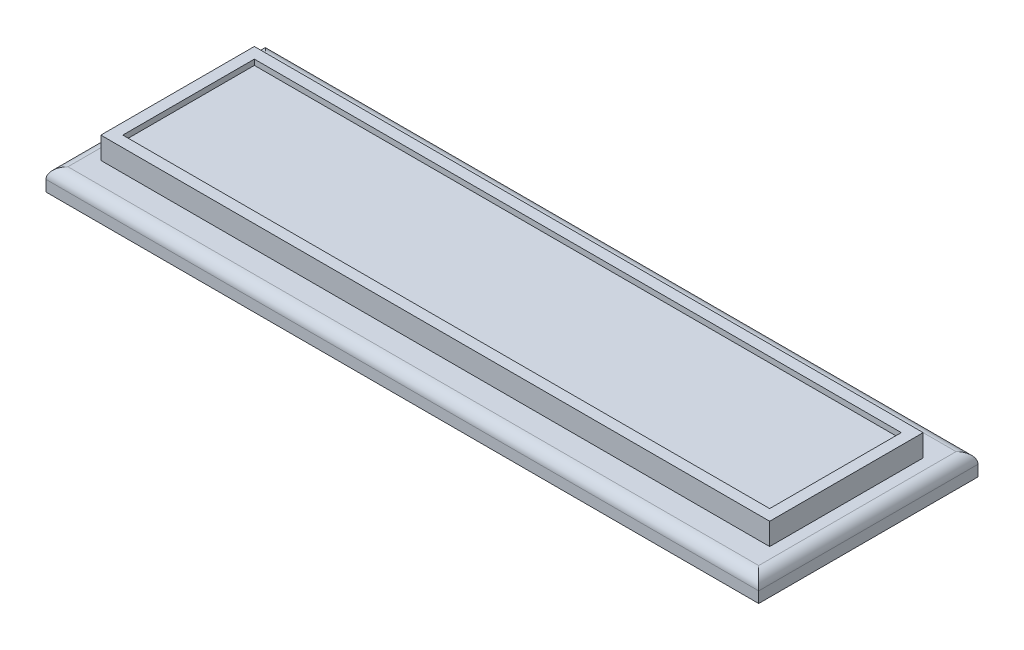
ISO-10303-21;
HEADER;
FILE_DESCRIPTION(('STEP AP214'),'2;1');
FILE_NAME('part.step','',(''),(''),'','','');
FILE_SCHEMA(('AUTOMOTIVE_DESIGN { 1 0 10303 214 1 1 1 1 }'));
ENDSEC;
DATA;
#1=APPLICATION_CONTEXT('core data for automotive mechanical design processes');
#2=APPLICATION_PROTOCOL_DEFINITION('international standard','automotive_design',2000,#1);
#3=PRODUCT_CONTEXT('',#1,'mechanical');
#4=PRODUCT('Part','Part','',(#3));
#5=PRODUCT_RELATED_PRODUCT_CATEGORY('part','',(#4));
#6=PRODUCT_DEFINITION_FORMATION('','',#4);
#7=PRODUCT_DEFINITION_CONTEXT('part definition',#1,'design');
#8=PRODUCT_DEFINITION('design','',#6,#7);
#9=PRODUCT_DEFINITION_SHAPE('','',#8);
#10=(LENGTH_UNIT() NAMED_UNIT(*) SI_UNIT(.MILLI.,.METRE.));
#11=(NAMED_UNIT(*) PLANE_ANGLE_UNIT() SI_UNIT($,.RADIAN.));
#12=(NAMED_UNIT(*) SI_UNIT($,.STERADIAN.) SOLID_ANGLE_UNIT());
#13=UNCERTAINTY_MEASURE_WITH_UNIT(LENGTH_MEASURE(1.E-05),#10,'distance_accuracy_value','');
#14=(GEOMETRIC_REPRESENTATION_CONTEXT(3) GLOBAL_UNCERTAINTY_ASSIGNED_CONTEXT((#13)) GLOBAL_UNIT_ASSIGNED_CONTEXT((#10,
#11,#12)) REPRESENTATION_CONTEXT('',''));
#15=CARTESIAN_POINT('',(0.,0.,0.));
#16=DIRECTION('',(0.,0.,1.));
#17=DIRECTION('',(1.,0.,0.));
#18=AXIS2_PLACEMENT_3D('',#15,#16,#17);
#19=CARTESIAN_POINT('',(0.,4.,0.));
#20=DIRECTION('',(0.,1.,0.));
#21=DIRECTION('',(0.,0.,1.));
#22=AXIS2_PLACEMENT_3D('',#19,#20,#21);
#23=PLANE('',#22);
#24=DIRECTION('',(0.,0.,1.));
#25=VECTOR('',#24,1.);
#26=CARTESIAN_POINT('',(2.,4.,3.));
#27=LINE('',#26,#25);
#28=CARTESIAN_POINT('',(2.,4.,3.));
#29=VERTEX_POINT('',#28);
#30=CARTESIAN_POINT('',(2.,4.,17.));
#31=VERTEX_POINT('',#30);
#32=EDGE_CURVE('E171',#29,#31,#27,.T.);
#33=ORIENTED_EDGE('',*,*,#32,.T.);
#34=DIRECTION('',(1.,0.,0.));
#35=VECTOR('',#34,1.);
#36=CARTESIAN_POINT('',(2.,4.,17.));
#37=LINE('',#36,#35);
#38=CARTESIAN_POINT('',(63.,4.,17.));
#39=VERTEX_POINT('',#38);
#40=EDGE_CURVE('E174',#31,#39,#37,.T.);
#41=ORIENTED_EDGE('',*,*,#40,.T.);
#42=DIRECTION('',(0.,0.,-1.));
#43=VECTOR('',#42,1.);
#44=CARTESIAN_POINT('',(63.,4.,3.));
#45=LINE('',#44,#43);
#46=CARTESIAN_POINT('',(63.,4.,3.));
#47=VERTEX_POINT('',#46);
#48=EDGE_CURVE('E177',#39,#47,#45,.T.);
#49=ORIENTED_EDGE('',*,*,#48,.T.);
#50=DIRECTION('',(-1.,0.,0.));
#51=VECTOR('',#50,1.);
#52=CARTESIAN_POINT('',(2.,4.,3.));
#53=LINE('',#52,#51);
#54=EDGE_CURVE('E179',#47,#29,#53,.T.);
#55=ORIENTED_EDGE('',*,*,#54,.T.);
#56=EDGE_LOOP('',(#33,#41,#49,#55));
#57=FACE_BOUND('',#56,.T.);
#58=DIRECTION('',(0.,0.,1.));
#59=VECTOR('',#58,1.);
#60=CARTESIAN_POINT('',(3.,4.,3.99615271282854));
#61=LINE('',#60,#59);
#62=CARTESIAN_POINT('',(3.,4.,3.99615271282854));
#63=VERTEX_POINT('',#62);
#64=CARTESIAN_POINT('',(3.,4.,16.));
#65=VERTEX_POINT('',#64);
#66=EDGE_CURVE('E156',#63,#65,#61,.T.);
#67=ORIENTED_EDGE('',*,*,#66,.F.);
#68=DIRECTION('',(1.,0.,0.));
#69=VECTOR('',#68,1.);
#70=CARTESIAN_POINT('',(3.,4.,3.99615271282854));
#71=LINE('',#70,#69);
#72=CARTESIAN_POINT('',(62.,4.,3.99615271282854));
#73=VERTEX_POINT('',#72);
#74=EDGE_CURVE('E240',#63,#73,#71,.T.);
#75=ORIENTED_EDGE('',*,*,#74,.T.);
#76=DIRECTION('',(0.,0.,1.));
#77=VECTOR('',#76,1.);
#78=CARTESIAN_POINT('',(62.,4.,3.99615271282854));
#79=LINE('',#78,#77);
#80=CARTESIAN_POINT('',(62.,4.,16.));
#81=VERTEX_POINT('',#80);
#82=EDGE_CURVE('E160',#73,#81,#79,.T.);
#83=ORIENTED_EDGE('',*,*,#82,.T.);
#84=DIRECTION('',(1.,0.,0.));
#85=VECTOR('',#84,1.);
#86=CARTESIAN_POINT('',(3.,4.,16.));
#87=LINE('',#86,#85);
#88=EDGE_CURVE('E247',#65,#81,#87,.T.);
#89=ORIENTED_EDGE('',*,*,#88,.F.);
#90=EDGE_LOOP('',(#67,#75,#83,#89));
#91=FACE_BOUND('',#90,.T.);
#92=ADVANCED_FACE('F35',(#57,#91),#23,.T.);
#93=CARTESIAN_POINT('',(0.,2.,0.));
#94=DIRECTION('',(0.,1.,0.));
#95=DIRECTION('',(0.,0.,1.));
#96=AXIS2_PLACEMENT_3D('',#93,#94,#95);
#97=PLANE('',#96);
#98=DIRECTION('',(0.,0.,1.));
#99=VECTOR('',#98,1.);
#100=CARTESIAN_POINT('',(1.,2.,20.));
#101=LINE('',#100,#99);
#102=CARTESIAN_POINT('',(1.,2.,1.));
#103=VERTEX_POINT('',#102);
#104=CARTESIAN_POINT('',(1.,2.,19.));
#105=VERTEX_POINT('',#104);
#106=EDGE_CURVE('E220',#103,#105,#101,.T.);
#107=ORIENTED_EDGE('',*,*,#106,.T.);
#108=DIRECTION('',(1.,0.,0.));
#109=VECTOR('',#108,1.);
#110=CARTESIAN_POINT('',(65.,2.,19.));
#111=LINE('',#110,#109);
#112=CARTESIAN_POINT('',(64.,2.,19.));
#113=VERTEX_POINT('',#112);
#114=EDGE_CURVE('E223',#105,#113,#111,.T.);
#115=ORIENTED_EDGE('',*,*,#114,.T.);
#116=DIRECTION('',(0.,0.,-1.));
#117=VECTOR('',#116,1.);
#118=CARTESIAN_POINT('',(64.,2.,0.));
#119=LINE('',#118,#117);
#120=CARTESIAN_POINT('',(64.,2.,1.));
#121=VERTEX_POINT('',#120);
#122=EDGE_CURVE('E218',#113,#121,#119,.T.);
#123=ORIENTED_EDGE('',*,*,#122,.T.);
#124=DIRECTION('',(-1.,0.,0.));
#125=VECTOR('',#124,1.);
#126=CARTESIAN_POINT('',(0.,2.,1.));
#127=LINE('',#126,#125);
#128=EDGE_CURVE('E216',#121,#103,#127,.T.);
#129=ORIENTED_EDGE('',*,*,#128,.T.);
#130=EDGE_LOOP('',(#107,#115,#123,#129));
#131=FACE_BOUND('',#130,.T.);
#132=DIRECTION('',(1.,0.,0.));
#133=VECTOR('',#132,1.);
#134=CARTESIAN_POINT('',(2.,2.,17.));
#135=LINE('',#134,#133);
#136=CARTESIAN_POINT('',(2.,2.,17.));
#137=VERTEX_POINT('',#136);
#138=CARTESIAN_POINT('',(63.,2.,17.));
#139=VERTEX_POINT('',#138);
#140=EDGE_CURVE('E165',#137,#139,#135,.T.);
#141=ORIENTED_EDGE('',*,*,#140,.F.);
#142=DIRECTION('',(0.,0.,1.));
#143=VECTOR('',#142,1.);
#144=CARTESIAN_POINT('',(2.,2.,3.));
#145=LINE('',#144,#143);
#146=CARTESIAN_POINT('',(2.,2.,3.));
#147=VERTEX_POINT('',#146);
#148=EDGE_CURVE('E161',#147,#137,#145,.T.);
#149=ORIENTED_EDGE('',*,*,#148,.F.);
#150=DIRECTION('',(-1.,0.,0.));
#151=VECTOR('',#150,1.);
#152=CARTESIAN_POINT('',(2.,2.,3.));
#153=LINE('',#152,#151);
#154=CARTESIAN_POINT('',(63.,2.,3.));
#155=VERTEX_POINT('',#154);
#156=EDGE_CURVE('E175',#155,#147,#153,.T.);
#157=ORIENTED_EDGE('',*,*,#156,.F.);
#158=DIRECTION('',(0.,0.,-1.));
#159=VECTOR('',#158,1.);
#160=CARTESIAN_POINT('',(63.,2.,3.));
#161=LINE('',#160,#159);
#162=EDGE_CURVE('E183',#139,#155,#161,.T.);
#163=ORIENTED_EDGE('',*,*,#162,.F.);
#164=EDGE_LOOP('',(#141,#149,#157,#163));
#165=FACE_BOUND('',#164,.T.);
#166=ADVANCED_FACE('F263',(#131,#165),#97,.T.);
#167=CARTESIAN_POINT('',(0.,2.,0.));
#168=DIRECTION('',(1.,0.,0.));
#169=DIRECTION('',(0.,0.,-1.));
#170=AXIS2_PLACEMENT_3D('',#167,#168,#169);
#171=PLANE('',#170);
#172=DIRECTION('',(0.,-1.,0.));
#173=VECTOR('',#172,1.);
#174=CARTESIAN_POINT('',(0.,2.,20.));
#175=LINE('',#174,#173);
#176=CARTESIAN_POINT('',(0.,1.,20.));
#177=VERTEX_POINT('',#176);
#178=CARTESIAN_POINT('',(0.,0.,20.));
#179=VERTEX_POINT('',#178);
#180=EDGE_CURVE('E214',#177,#179,#175,.T.);
#181=ORIENTED_EDGE('',*,*,#180,.F.);
#182=DIRECTION('',(0.,0.,1.));
#183=VECTOR('',#182,1.);
#184=CARTESIAN_POINT('',(0.,1.,0.));
#185=LINE('',#184,#183);
#186=CARTESIAN_POINT('',(0.,1.,0.));
#187=VERTEX_POINT('',#186);
#188=EDGE_CURVE('E225',#177,#187,#185,.F.);
#189=ORIENTED_EDGE('',*,*,#188,.T.);
#190=DIRECTION('',(0.,-1.,0.));
#191=VECTOR('',#190,1.);
#192=CARTESIAN_POINT('',(0.,2.,0.));
#193=LINE('',#192,#191);
#194=CARTESIAN_POINT('',(0.,0.,0.));
#195=VERTEX_POINT('',#194);
#196=EDGE_CURVE('E208',#187,#195,#193,.T.);
#197=ORIENTED_EDGE('',*,*,#196,.T.);
#198=DIRECTION('',(0.,0.,1.));
#199=VECTOR('',#198,1.);
#200=CARTESIAN_POINT('',(0.,0.,0.));
#201=LINE('',#200,#199);
#202=EDGE_CURVE('E196',#195,#179,#201,.T.);
#203=ORIENTED_EDGE('',*,*,#202,.T.);
#204=EDGE_LOOP('',(#181,#189,#197,#203));
#205=FACE_BOUND('',#204,.T.);
#206=ADVANCED_FACE('F269',(#205),#171,.F.);
#207=CARTESIAN_POINT('',(0.,2.,20.));
#208=DIRECTION('',(0.,0.,-1.));
#209=DIRECTION('',(-1.,0.,0.));
#210=AXIS2_PLACEMENT_3D('',#207,#208,#209);
#211=PLANE('',#210);
#212=DIRECTION('',(0.,-1.,0.));
#213=VECTOR('',#212,1.);
#214=CARTESIAN_POINT('',(65.,2.,20.));
#215=LINE('',#214,#213);
#216=CARTESIAN_POINT('',(65.,1.,20.));
#217=VERTEX_POINT('',#216);
#218=CARTESIAN_POINT('',(65.,0.,20.));
#219=VERTEX_POINT('',#218);
#220=EDGE_CURVE('E212',#217,#219,#215,.T.);
#221=ORIENTED_EDGE('',*,*,#220,.F.);
#222=DIRECTION('',(1.,0.,0.));
#223=VECTOR('',#222,1.);
#224=CARTESIAN_POINT('',(0.,1.,20.));
#225=LINE('',#224,#223);
#226=EDGE_CURVE('E44',#217,#177,#225,.F.);
#227=ORIENTED_EDGE('',*,*,#226,.T.);
#228=ORIENTED_EDGE('',*,*,#180,.T.);
#229=DIRECTION('',(1.,0.,0.));
#230=VECTOR('',#229,1.);
#231=CARTESIAN_POINT('',(0.,0.,20.));
#232=LINE('',#231,#230);
#233=EDGE_CURVE('E199',#179,#219,#232,.T.);
#234=ORIENTED_EDGE('',*,*,#233,.T.);
#235=EDGE_LOOP('',(#221,#227,#228,#234));
#236=FACE_BOUND('',#235,.T.);
#237=ADVANCED_FACE('F301',(#236),#211,.F.);
#238=CARTESIAN_POINT('',(65.,2.,0.));
#239=DIRECTION('',(-1.,0.,0.));
#240=DIRECTION('',(0.,0.,1.));
#241=AXIS2_PLACEMENT_3D('',#238,#239,#240);
#242=PLANE('',#241);
#243=DIRECTION('',(0.,-1.,0.));
#244=VECTOR('',#243,1.);
#245=CARTESIAN_POINT('',(65.,2.,0.));
#246=LINE('',#245,#244);
#247=CARTESIAN_POINT('',(65.,1.,0.));
#248=VERTEX_POINT('',#247);
#249=CARTESIAN_POINT('',(65.,0.,0.));
#250=VERTEX_POINT('',#249);
#251=EDGE_CURVE('E210',#248,#250,#246,.T.);
#252=ORIENTED_EDGE('',*,*,#251,.F.);
#253=DIRECTION('',(0.,0.,-1.));
#254=VECTOR('',#253,1.);
#255=CARTESIAN_POINT('',(65.,1.,20.));
#256=LINE('',#255,#254);
#257=EDGE_CURVE('E52',#248,#217,#256,.F.);
#258=ORIENTED_EDGE('',*,*,#257,.T.);
#259=ORIENTED_EDGE('',*,*,#220,.T.);
#260=DIRECTION('',(0.,0.,-1.));
#261=VECTOR('',#260,1.);
#262=CARTESIAN_POINT('',(65.,0.,0.));
#263=LINE('',#262,#261);
#264=EDGE_CURVE('E202',#219,#250,#263,.T.);
#265=ORIENTED_EDGE('',*,*,#264,.T.);
#266=EDGE_LOOP('',(#252,#258,#259,#265));
#267=FACE_BOUND('',#266,.T.);
#268=ADVANCED_FACE('F298',(#267),#242,.F.);
#269=CARTESIAN_POINT('',(0.,2.,0.));
#270=DIRECTION('',(0.,0.,1.));
#271=DIRECTION('',(1.,0.,0.));
#272=AXIS2_PLACEMENT_3D('',#269,#270,#271);
#273=PLANE('',#272);
#274=ORIENTED_EDGE('',*,*,#196,.F.);
#275=DIRECTION('',(-1.,0.,0.));
#276=VECTOR('',#275,1.);
#277=CARTESIAN_POINT('',(65.,1.,0.));
#278=LINE('',#277,#276);
#279=EDGE_CURVE('E11',#187,#248,#278,.F.);
#280=ORIENTED_EDGE('',*,*,#279,.T.);
#281=ORIENTED_EDGE('',*,*,#251,.T.);
#282=DIRECTION('',(-1.,0.,0.));
#283=VECTOR('',#282,1.);
#284=CARTESIAN_POINT('',(0.,0.,0.));
#285=LINE('',#284,#283);
#286=EDGE_CURVE('E205',#250,#195,#285,.T.);
#287=ORIENTED_EDGE('',*,*,#286,.T.);
#288=EDGE_LOOP('',(#274,#280,#281,#287));
#289=FACE_BOUND('',#288,.T.);
#290=ADVANCED_FACE('F294',(#289),#273,.F.);
#291=CARTESIAN_POINT('',(0.,0.,0.));
#292=DIRECTION('',(0.,1.,0.));
#293=DIRECTION('',(0.,0.,1.));
#294=AXIS2_PLACEMENT_3D('',#291,#292,#293);
#295=PLANE('',#294);
#296=ORIENTED_EDGE('',*,*,#202,.F.);
#297=ORIENTED_EDGE('',*,*,#286,.F.);
#298=ORIENTED_EDGE('',*,*,#264,.F.);
#299=ORIENTED_EDGE('',*,*,#233,.F.);
#300=EDGE_LOOP('',(#296,#297,#298,#299));
#301=FACE_BOUND('',#300,.T.);
#302=ADVANCED_FACE('F289',(#301),#295,.F.);
#303=CARTESIAN_POINT('',(2.,4.,3.));
#304=DIRECTION('',(1.,0.,0.));
#305=DIRECTION('',(0.,0.,-1.));
#306=AXIS2_PLACEMENT_3D('',#303,#304,#305);
#307=PLANE('',#306);
#308=ORIENTED_EDGE('',*,*,#148,.T.);
#309=DIRECTION('',(0.,-1.,0.));
#310=VECTOR('',#309,1.);
#311=CARTESIAN_POINT('',(2.,4.,17.));
#312=LINE('',#311,#310);
#313=EDGE_CURVE('E194',#31,#137,#312,.T.);
#314=ORIENTED_EDGE('',*,*,#313,.F.);
#315=ORIENTED_EDGE('',*,*,#32,.F.);
#316=DIRECTION('',(0.,-1.,0.));
#317=VECTOR('',#316,1.);
#318=CARTESIAN_POINT('',(2.,4.,3.));
#319=LINE('',#318,#317);
#320=EDGE_CURVE('E180',#29,#147,#319,.T.);
#321=ORIENTED_EDGE('',*,*,#320,.T.);
#322=EDGE_LOOP('',(#308,#314,#315,#321));
#323=FACE_BOUND('',#322,.T.);
#324=ADVANCED_FACE('F286',(#323),#307,.F.);
#325=CARTESIAN_POINT('',(2.,4.,17.));
#326=DIRECTION('',(0.,0.,-1.));
#327=DIRECTION('',(-1.,0.,0.));
#328=AXIS2_PLACEMENT_3D('',#325,#326,#327);
#329=PLANE('',#328);
#330=ORIENTED_EDGE('',*,*,#140,.T.);
#331=DIRECTION('',(0.,-1.,0.));
#332=VECTOR('',#331,1.);
#333=CARTESIAN_POINT('',(63.,4.,17.));
#334=LINE('',#333,#332);
#335=EDGE_CURVE('E191',#39,#139,#334,.T.);
#336=ORIENTED_EDGE('',*,*,#335,.F.);
#337=ORIENTED_EDGE('',*,*,#40,.F.);
#338=ORIENTED_EDGE('',*,*,#313,.T.);
#339=EDGE_LOOP('',(#330,#336,#337,#338));
#340=FACE_BOUND('',#339,.T.);
#341=ADVANCED_FACE('F282',(#340),#329,.F.);
#342=CARTESIAN_POINT('',(63.,4.,3.));
#343=DIRECTION('',(-1.,0.,0.));
#344=DIRECTION('',(0.,0.,1.));
#345=AXIS2_PLACEMENT_3D('',#342,#343,#344);
#346=PLANE('',#345);
#347=ORIENTED_EDGE('',*,*,#162,.T.);
#348=DIRECTION('',(0.,-1.,0.));
#349=VECTOR('',#348,1.);
#350=CARTESIAN_POINT('',(63.,4.,3.));
#351=LINE('',#350,#349);
#352=EDGE_CURVE('E189',#47,#155,#351,.T.);
#353=ORIENTED_EDGE('',*,*,#352,.F.);
#354=ORIENTED_EDGE('',*,*,#48,.F.);
#355=ORIENTED_EDGE('',*,*,#335,.T.);
#356=EDGE_LOOP('',(#347,#353,#354,#355));
#357=FACE_BOUND('',#356,.T.);
#358=ADVANCED_FACE('F278',(#357),#346,.F.);
#359=CARTESIAN_POINT('',(2.,4.,3.));
#360=DIRECTION('',(0.,0.,1.));
#361=DIRECTION('',(1.,0.,0.));
#362=AXIS2_PLACEMENT_3D('',#359,#360,#361);
#363=PLANE('',#362);
#364=ORIENTED_EDGE('',*,*,#156,.T.);
#365=ORIENTED_EDGE('',*,*,#320,.F.);
#366=ORIENTED_EDGE('',*,*,#54,.F.);
#367=ORIENTED_EDGE('',*,*,#352,.T.);
#368=EDGE_LOOP('',(#364,#365,#366,#367));
#369=FACE_BOUND('',#368,.T.);
#370=ADVANCED_FACE('F275',(#369),#363,.F.);
#371=CARTESIAN_POINT('',(3.,3.5,3.99615271282854));
#372=DIRECTION('',(0.,0.,1.));
#373=DIRECTION('',(1.,0.,0.));
#374=AXIS2_PLACEMENT_3D('',#371,#372,#373);
#375=PLANE('',#374);
#376=ORIENTED_EDGE('',*,*,#74,.F.);
#377=DIRECTION('',(0.,1.,0.));
#378=VECTOR('',#377,1.);
#379=CARTESIAN_POINT('',(3.,3.5,3.99615271282854));
#380=LINE('',#379,#378);
#381=CARTESIAN_POINT('',(3.,3.5,3.99615271282854));
#382=VERTEX_POINT('',#381);
#383=EDGE_CURVE('E155',#382,#63,#380,.T.);
#384=ORIENTED_EDGE('',*,*,#383,.F.);
#385=DIRECTION('',(1.,0.,0.));
#386=VECTOR('',#385,1.);
#387=CARTESIAN_POINT('',(3.,3.5,3.99615271282854));
#388=LINE('',#387,#386);
#389=CARTESIAN_POINT('',(62.,3.5,3.99615271282854));
#390=VERTEX_POINT('',#389);
#391=EDGE_CURVE('E141',#382,#390,#388,.T.);
#392=ORIENTED_EDGE('',*,*,#391,.T.);
#393=DIRECTION('',(0.,1.,0.));
#394=VECTOR('',#393,1.);
#395=CARTESIAN_POINT('',(62.,3.5,3.99615271282854));
#396=LINE('',#395,#394);
#397=EDGE_CURVE('E152',#390,#73,#396,.T.);
#398=ORIENTED_EDGE('',*,*,#397,.T.);
#399=EDGE_LOOP('',(#376,#384,#392,#398));
#400=FACE_BOUND('',#399,.T.);
#401=ADVANCED_FACE('F151',(#400),#375,.T.);
#402=CARTESIAN_POINT('',(62.,3.5,3.99615271282854));
#403=DIRECTION('',(-1.,0.,0.));
#404=DIRECTION('',(0.,0.,1.));
#405=AXIS2_PLACEMENT_3D('',#402,#403,#404);
#406=PLANE('',#405);
#407=ORIENTED_EDGE('',*,*,#82,.F.);
#408=ORIENTED_EDGE('',*,*,#397,.F.);
#409=DIRECTION('',(0.,0.,1.));
#410=VECTOR('',#409,1.);
#411=CARTESIAN_POINT('',(62.,3.5,3.99615271282854));
#412=LINE('',#411,#410);
#413=CARTESIAN_POINT('',(62.,3.5,16.));
#414=VERTEX_POINT('',#413);
#415=EDGE_CURVE('E137',#390,#414,#412,.T.);
#416=ORIENTED_EDGE('',*,*,#415,.T.);
#417=DIRECTION('',(0.,1.,0.));
#418=VECTOR('',#417,1.);
#419=CARTESIAN_POINT('',(62.,3.5,16.));
#420=LINE('',#419,#418);
#421=EDGE_CURVE('E162',#414,#81,#420,.T.);
#422=ORIENTED_EDGE('',*,*,#421,.T.);
#423=EDGE_LOOP('',(#407,#408,#416,#422));
#424=FACE_BOUND('',#423,.T.);
#425=ADVANCED_FACE('F158',(#424),#406,.T.);
#426=CARTESIAN_POINT('',(3.,3.5,16.));
#427=DIRECTION('',(0.,0.,1.));
#428=DIRECTION('',(1.,0.,0.));
#429=AXIS2_PLACEMENT_3D('',#426,#427,#428);
#430=PLANE('',#429);
#431=ORIENTED_EDGE('',*,*,#88,.T.);
#432=ORIENTED_EDGE('',*,*,#421,.F.);
#433=DIRECTION('',(1.,0.,0.));
#434=VECTOR('',#433,1.);
#435=CARTESIAN_POINT('',(3.,3.5,16.));
#436=LINE('',#435,#434);
#437=CARTESIAN_POINT('',(3.,3.5,16.));
#438=VERTEX_POINT('',#437);
#439=EDGE_CURVE('E144',#438,#414,#436,.T.);
#440=ORIENTED_EDGE('',*,*,#439,.F.);
#441=DIRECTION('',(0.,1.,0.));
#442=VECTOR('',#441,1.);
#443=CARTESIAN_POINT('',(3.,3.5,16.));
#444=LINE('',#443,#442);
#445=EDGE_CURVE('E167',#438,#65,#444,.T.);
#446=ORIENTED_EDGE('',*,*,#445,.T.);
#447=EDGE_LOOP('',(#431,#432,#440,#446));
#448=FACE_BOUND('',#447,.T.);
#449=ADVANCED_FACE('F258',(#448),#430,.F.);
#450=CARTESIAN_POINT('',(3.,3.5,3.99615271282854));
#451=DIRECTION('',(-1.,0.,0.));
#452=DIRECTION('',(0.,0.,1.));
#453=AXIS2_PLACEMENT_3D('',#450,#451,#452);
#454=PLANE('',#453);
#455=ORIENTED_EDGE('',*,*,#66,.T.);
#456=ORIENTED_EDGE('',*,*,#445,.F.);
#457=DIRECTION('',(0.,0.,1.));
#458=VECTOR('',#457,1.);
#459=CARTESIAN_POINT('',(3.,3.5,3.99615271282854));
#460=LINE('',#459,#458);
#461=EDGE_CURVE('E250',#382,#438,#460,.T.);
#462=ORIENTED_EDGE('',*,*,#461,.F.);
#463=ORIENTED_EDGE('',*,*,#383,.T.);
#464=EDGE_LOOP('',(#455,#456,#462,#463));
#465=FACE_BOUND('',#464,.T.);
#466=ADVANCED_FACE('F261',(#465),#454,.F.);
#467=CARTESIAN_POINT('',(0.,3.5,0.));
#468=DIRECTION('',(0.,-1.,0.));
#469=DIRECTION('',(0.,0.,-1.));
#470=AXIS2_PLACEMENT_3D('',#467,#468,#469);
#471=PLANE('',#470);
#472=ORIENTED_EDGE('',*,*,#391,.F.);
#473=ORIENTED_EDGE('',*,*,#461,.T.);
#474=ORIENTED_EDGE('',*,*,#439,.T.);
#475=ORIENTED_EDGE('',*,*,#415,.F.);
#476=EDGE_LOOP('',(#472,#473,#474,#475));
#477=FACE_BOUND('',#476,.T.);
#478=ADVANCED_FACE('F139',(#477),#471,.F.);
#479=CARTESIAN_POINT('',(64.,1.,0.));
#480=DIRECTION('',(0.,0.,1.));
#481=DIRECTION('',(1.,0.,0.));
#482=AXIS2_PLACEMENT_3D('',#479,#480,#481);
#483=CYLINDRICAL_SURFACE('',#482,1.);
#484=CARTESIAN_POINT('',(64.,1.,19.));
#485=DIRECTION('',(-0.707106781186547,0.,0.707106781186547));
#486=DIRECTION('',(-0.707106781186547,0.,-0.707106781186547));
#487=AXIS2_PLACEMENT_3D('',#484,#485,#486);
#488=ELLIPSE('',#487,1.41421356237309,1.);
#489=EDGE_CURVE('E233',#217,#113,#488,.T.);
#490=ORIENTED_EDGE('',*,*,#489,.F.);
#491=ORIENTED_EDGE('',*,*,#257,.F.);
#492=CARTESIAN_POINT('',(64.,1.,1.));
#493=DIRECTION('',(0.707106781186547,0.,0.707106781186547));
#494=DIRECTION('',(0.707106781186547,0.,-0.707106781186547));
#495=AXIS2_PLACEMENT_3D('',#492,#493,#494);
#496=ELLIPSE('',#495,1.41421356237309,1.);
#497=EDGE_CURVE('E39',#121,#248,#496,.F.);
#498=ORIENTED_EDGE('',*,*,#497,.F.);
#499=ORIENTED_EDGE('',*,*,#122,.F.);
#500=EDGE_LOOP('',(#490,#491,#498,#499));
#501=FACE_BOUND('',#500,.T.);
#502=ADVANCED_FACE('F37',(#501),#483,.T.);
#503=CARTESIAN_POINT('',(0.,1.,1.));
#504=DIRECTION('',(1.,0.,0.));
#505=DIRECTION('',(0.,0.,-1.));
#506=AXIS2_PLACEMENT_3D('',#503,#504,#505);
#507=CYLINDRICAL_SURFACE('',#506,1.);
#508=ORIENTED_EDGE('',*,*,#497,.T.);
#509=ORIENTED_EDGE('',*,*,#279,.F.);
#510=CARTESIAN_POINT('',(1.,1.,1.));
#511=DIRECTION('',(0.707106781186547,0.,-0.707106781186548));
#512=DIRECTION('',(0.707106781186548,0.,0.707106781186547));
#513=AXIS2_PLACEMENT_3D('',#510,#511,#512);
#514=ELLIPSE('',#513,1.4142135623731,1.);
#515=EDGE_CURVE('E232',#103,#187,#514,.F.);
#516=ORIENTED_EDGE('',*,*,#515,.F.);
#517=ORIENTED_EDGE('',*,*,#128,.F.);
#518=EDGE_LOOP('',(#508,#509,#516,#517));
#519=FACE_BOUND('',#518,.T.);
#520=ADVANCED_FACE('F314',(#519),#507,.T.);
#521=CARTESIAN_POINT('',(0.,1.,19.));
#522=DIRECTION('',(-1.,0.,0.));
#523=DIRECTION('',(0.,0.,1.));
#524=AXIS2_PLACEMENT_3D('',#521,#522,#523);
#525=CYLINDRICAL_SURFACE('',#524,1.);
#526=ORIENTED_EDGE('',*,*,#489,.T.);
#527=ORIENTED_EDGE('',*,*,#114,.F.);
#528=CARTESIAN_POINT('',(1.,1.,19.));
#529=DIRECTION('',(-0.707106781186548,0.,-0.707106781186547));
#530=DIRECTION('',(-0.707106781186547,0.,0.707106781186548));
#531=AXIS2_PLACEMENT_3D('',#528,#529,#530);
#532=ELLIPSE('',#531,1.41421356237309,1.);
#533=EDGE_CURVE('E230',#177,#105,#532,.T.);
#534=ORIENTED_EDGE('',*,*,#533,.F.);
#535=ORIENTED_EDGE('',*,*,#226,.F.);
#536=EDGE_LOOP('',(#526,#527,#534,#535));
#537=FACE_BOUND('',#536,.T.);
#538=ADVANCED_FACE('F311',(#537),#525,.T.);
#539=CARTESIAN_POINT('',(1.,1.,0.));
#540=DIRECTION('',(0.,0.,-1.));
#541=DIRECTION('',(-1.,0.,0.));
#542=AXIS2_PLACEMENT_3D('',#539,#540,#541);
#543=CYLINDRICAL_SURFACE('',#542,1.);
#544=ORIENTED_EDGE('',*,*,#515,.T.);
#545=ORIENTED_EDGE('',*,*,#188,.F.);
#546=ORIENTED_EDGE('',*,*,#533,.T.);
#547=ORIENTED_EDGE('',*,*,#106,.F.);
#548=EDGE_LOOP('',(#544,#545,#546,#547));
#549=FACE_BOUND('',#548,.T.);
#550=ADVANCED_FACE('F308',(#549),#543,.T.);
#551=CLOSED_SHELL('',(#92,#166,#206,#237,#268,#290,#302,#324,#341,#358,#370,#401,#425,#449,#466,
#478,#502,#520,#538,#550));
#552=MANIFOLD_SOLID_BREP('B2',#551);
#553=ADVANCED_BREP_SHAPE_REPRESENTATION('',(#18,#552),#14);
#554=SHAPE_DEFINITION_REPRESENTATION(#9,#553);
ENDSEC;
END-ISO-10303-21;
